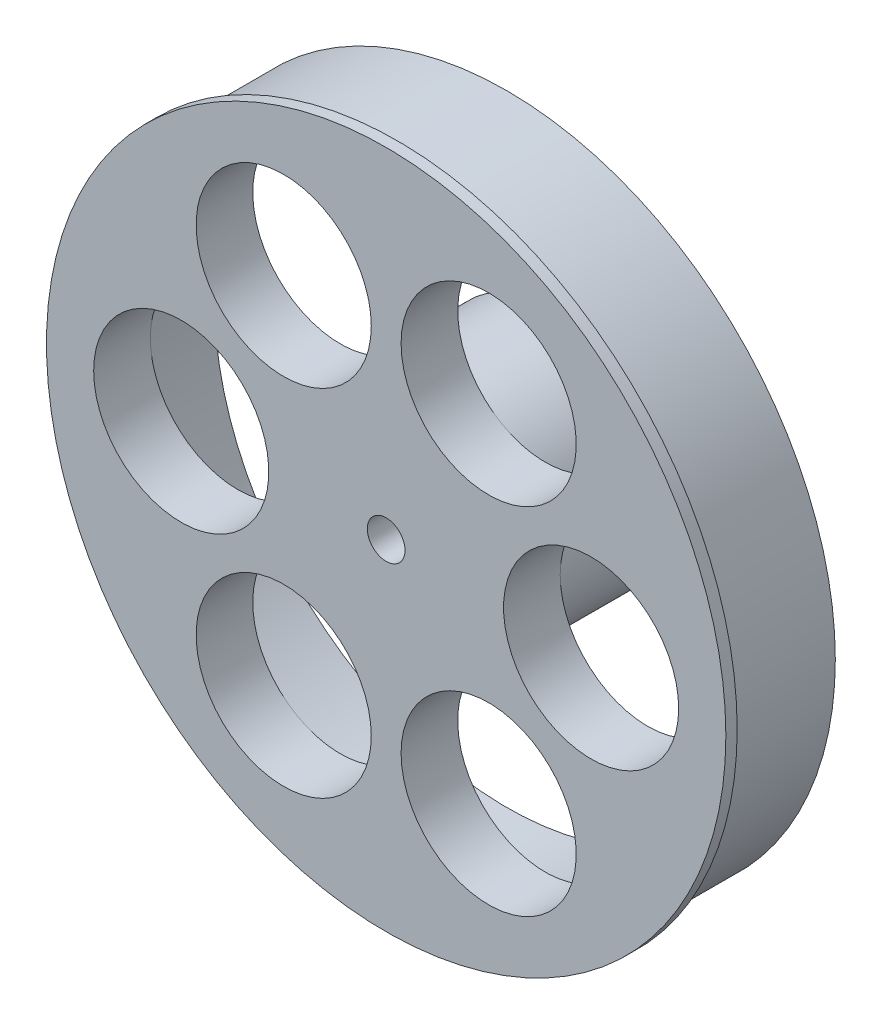
ISO-10303-21;
HEADER;
FILE_DESCRIPTION(('STEP AP214'),'2;1');
FILE_NAME('part.step','',(''),(''),'','','');
FILE_SCHEMA(('AUTOMOTIVE_DESIGN { 1 0 10303 214 1 1 1 1 }'));
ENDSEC;
DATA;
#1=APPLICATION_CONTEXT('core data for automotive mechanical design processes');
#2=APPLICATION_PROTOCOL_DEFINITION('international standard','automotive_design',2000,#1);
#3=PRODUCT_CONTEXT('',#1,'mechanical');
#4=PRODUCT('Part','Part','',(#3));
#5=PRODUCT_RELATED_PRODUCT_CATEGORY('part','',(#4));
#6=PRODUCT_DEFINITION_FORMATION('','',#4);
#7=PRODUCT_DEFINITION_CONTEXT('part definition',#1,'design');
#8=PRODUCT_DEFINITION('design','',#6,#7);
#9=PRODUCT_DEFINITION_SHAPE('','',#8);
#10=(LENGTH_UNIT() NAMED_UNIT(*) SI_UNIT(.MILLI.,.METRE.));
#11=(NAMED_UNIT(*) PLANE_ANGLE_UNIT() SI_UNIT($,.RADIAN.));
#12=(NAMED_UNIT(*) SI_UNIT($,.STERADIAN.) SOLID_ANGLE_UNIT());
#13=UNCERTAINTY_MEASURE_WITH_UNIT(LENGTH_MEASURE(1.E-05),#10,'distance_accuracy_value','');
#14=(GEOMETRIC_REPRESENTATION_CONTEXT(3) GLOBAL_UNCERTAINTY_ASSIGNED_CONTEXT((#13)) GLOBAL_UNIT_ASSIGNED_CONTEXT((#10,
#11,#12)) REPRESENTATION_CONTEXT('',''));
#15=CARTESIAN_POINT('',(0.,0.,0.));
#16=DIRECTION('',(0.,0.,1.));
#17=DIRECTION('',(1.,0.,0.));
#18=AXIS2_PLACEMENT_3D('',#15,#16,#17);
#19=CARTESIAN_POINT('',(0.,7.75,-1.5));
#20=DIRECTION('',(0.,0.,1.));
#21=DIRECTION('',(1.,0.,0.));
#22=AXIS2_PLACEMENT_3D('',#19,#20,#21);
#23=PLANE('',#22);
#24=CARTESIAN_POINT('',(0.,0.,-1.5));
#25=DIRECTION('',(0.,0.,1.));
#26=DIRECTION('',(1.,0.,0.));
#27=AXIS2_PLACEMENT_3D('',#24,#25,#26);
#28=CIRCLE('',#27,7.75);
#29=CARTESIAN_POINT('',(3.87500000000008,6.71169687932936,-1.5));
#30=VERTEX_POINT('',#29);
#31=CARTESIAN_POINT('',(-3.87499999999994,6.71169687932943,-1.5));
#32=VERTEX_POINT('',#31);
#33=EDGE_CURVE('E124',#30,#32,#28,.T.);
#34=ORIENTED_EDGE('',*,*,#33,.F.);
#35=CARTESIAN_POINT('',(2.71500000000005,4.70251794254947,-1.5));
#36=DIRECTION('',(0.,0.,1.));
#37=DIRECTION('',(1.,0.,0.));
#38=AXIS2_PLACEMENT_3D('',#35,#36,#37);
#39=CIRCLE('',#38,2.32);
#40=CARTESIAN_POINT('',(1.55500000000003,2.69333900576959,-1.5));
#41=VERTEX_POINT('',#40);
#42=EDGE_CURVE('E58',#41,#30,#39,.F.);
#43=ORIENTED_EDGE('',*,*,#42,.F.);
#44=CARTESIAN_POINT('',(0.,0.,-1.5));
#45=DIRECTION('',(0.,0.,1.));
#46=DIRECTION('',(1.,0.,0.));
#47=AXIS2_PLACEMENT_3D('',#44,#45,#46);
#48=CIRCLE('',#47,3.11);
#49=CARTESIAN_POINT('',(-1.55499999999997,2.69333900576962,-1.5));
#50=VERTEX_POINT('',#49);
#51=EDGE_CURVE('E276',#41,#50,#48,.T.);
#52=ORIENTED_EDGE('',*,*,#51,.T.);
#53=CARTESIAN_POINT('',(-2.71499999999996,4.70251794254953,-1.5));
#54=DIRECTION('',(0.,0.,1.));
#55=DIRECTION('',(1.,0.,0.));
#56=AXIS2_PLACEMENT_3D('',#53,#54,#55);
#57=CIRCLE('',#56,2.32);
#58=EDGE_CURVE('E237',#32,#50,#57,.F.);
#59=ORIENTED_EDGE('',*,*,#58,.F.);
#60=EDGE_LOOP('',(#34,#43,#52,#59));
#61=FACE_BOUND('',#60,.T.);
#62=ADVANCED_FACE('F37',(#61),#23,.F.);
#63=CARTESIAN_POINT('',(-7.75,0.,-1.5));
#64=VERTEX_POINT('',#63);
#65=EDGE_CURVE('E123',#32,#64,#28,.T.);
#66=ORIENTED_EDGE('',*,*,#65,.F.);
#67=EDGE_CURVE('E51',#50,#32,#57,.F.);
#68=ORIENTED_EDGE('',*,*,#67,.F.);
#69=CARTESIAN_POINT('',(-3.11,0.,-1.5));
#70=VERTEX_POINT('',#69);
#71=EDGE_CURVE('E281',#50,#70,#48,.T.);
#72=ORIENTED_EDGE('',*,*,#71,.T.);
#73=CARTESIAN_POINT('',(-5.43,0.,-1.5));
#74=DIRECTION('',(0.,0.,1.));
#75=DIRECTION('',(1.,0.,0.));
#76=AXIS2_PLACEMENT_3D('',#73,#74,#75);
#77=CIRCLE('',#76,2.32);
#78=EDGE_CURVE('E228',#64,#70,#77,.F.);
#79=ORIENTED_EDGE('',*,*,#78,.F.);
#80=EDGE_LOOP('',(#66,#68,#72,#79));
#81=FACE_BOUND('',#80,.T.);
#82=ADVANCED_FACE('F171',(#81),#23,.F.);
#83=CARTESIAN_POINT('',(3.11,0.,-1.5));
#84=VERTEX_POINT('',#83);
#85=EDGE_CURVE('E129',#84,#41,#48,.T.);
#86=ORIENTED_EDGE('',*,*,#85,.T.);
#87=EDGE_CURVE('E242',#30,#41,#39,.F.);
#88=ORIENTED_EDGE('',*,*,#87,.F.);
#89=CARTESIAN_POINT('',(7.75,0.,-1.5));
#90=VERTEX_POINT('',#89);
#91=EDGE_CURVE('E125',#90,#30,#28,.T.);
#92=ORIENTED_EDGE('',*,*,#91,.F.);
#93=CARTESIAN_POINT('',(5.43,0.,-1.5));
#94=DIRECTION('',(0.,0.,1.));
#95=DIRECTION('',(1.,0.,0.));
#96=AXIS2_PLACEMENT_3D('',#93,#94,#95);
#97=CIRCLE('',#96,2.32);
#98=EDGE_CURVE('E251',#84,#90,#97,.F.);
#99=ORIENTED_EDGE('',*,*,#98,.F.);
#100=EDGE_LOOP('',(#86,#88,#92,#99));
#101=FACE_BOUND('',#100,.T.);
#102=ADVANCED_FACE('F176',(#101),#23,.F.);
#103=CARTESIAN_POINT('',(-3.87500000000003,-6.71169687932938,-1.5));
#104=VERTEX_POINT('',#103);
#105=EDGE_CURVE('E105',#64,#104,#28,.T.);
#106=ORIENTED_EDGE('',*,*,#105,.F.);
#107=EDGE_CURVE('E226',#70,#64,#77,.F.);
#108=ORIENTED_EDGE('',*,*,#107,.F.);
#109=CARTESIAN_POINT('',(-1.55500000000001,-2.6933390057696,-1.5));
#110=VERTEX_POINT('',#109);
#111=EDGE_CURVE('E108',#70,#110,#48,.T.);
#112=ORIENTED_EDGE('',*,*,#111,.T.);
#113=CARTESIAN_POINT('',(-2.71500000000002,-4.70251794254949,-1.5));
#114=DIRECTION('',(0.,0.,1.));
#115=DIRECTION('',(1.,0.,0.));
#116=AXIS2_PLACEMENT_3D('',#113,#114,#115);
#117=CIRCLE('',#116,2.32);
#118=EDGE_CURVE('E92',#104,#110,#117,.F.);
#119=ORIENTED_EDGE('',*,*,#118,.F.);
#120=EDGE_LOOP('',(#106,#108,#112,#119));
#121=FACE_BOUND('',#120,.T.);
#122=ADVANCED_FACE('F102',(#121),#23,.F.);
#123=CARTESIAN_POINT('',(3.87499999999998,-6.71169687932941,-1.5));
#124=VERTEX_POINT('',#123);
#125=EDGE_CURVE('E112',#104,#124,#28,.T.);
#126=ORIENTED_EDGE('',*,*,#125,.F.);
#127=EDGE_CURVE('E89',#110,#104,#117,.F.);
#128=ORIENTED_EDGE('',*,*,#127,.F.);
#129=CARTESIAN_POINT('',(1.55499999999999,-2.69333900576961,-1.5));
#130=VERTEX_POINT('',#129);
#131=EDGE_CURVE('E271',#110,#130,#48,.T.);
#132=ORIENTED_EDGE('',*,*,#131,.T.);
#133=CARTESIAN_POINT('',(2.71499999999999,-4.70251794254951,-1.5));
#134=DIRECTION('',(0.,0.,1.));
#135=DIRECTION('',(1.,0.,0.));
#136=AXIS2_PLACEMENT_3D('',#133,#134,#135);
#137=CIRCLE('',#136,2.32);
#138=EDGE_CURVE('E114',#124,#130,#137,.F.);
#139=ORIENTED_EDGE('',*,*,#138,.F.);
#140=EDGE_LOOP('',(#126,#128,#132,#139));
#141=FACE_BOUND('',#140,.T.);
#142=ADVANCED_FACE('F113',(#141),#23,.F.);
#143=CARTESIAN_POINT('',(0.,0.5,0.));
#144=DIRECTION('',(0.,0.,-1.));
#145=DIRECTION('',(-1.,0.,0.));
#146=AXIS2_PLACEMENT_3D('',#143,#144,#145);
#147=PLANE('',#146);
#148=CARTESIAN_POINT('',(2.71500000000005,4.70251794254947,0.));
#149=DIRECTION('',(0.,0.,1.));
#150=DIRECTION('',(0.50000000000001,0.866025403784433,0.));
#151=AXIS2_PLACEMENT_3D('',#148,#149,#150);
#152=CIRCLE('',#151,2.32);
#153=CARTESIAN_POINT('',(3.87500000000008,6.71169687932935,0.));
#154=VERTEX_POINT('',#153);
#155=EDGE_CURVE('E239',#154,#154,#152,.T.);
#156=ORIENTED_EDGE('',*,*,#155,.F.);
#157=EDGE_LOOP('',(#156));
#158=FACE_BOUND('',#157,.T.);
#159=CARTESIAN_POINT('',(-2.71499999999996,4.70251794254953,0.));
#160=DIRECTION('',(0.,0.,1.));
#161=DIRECTION('',(-0.499999999999992,0.866025403784443,0.));
#162=AXIS2_PLACEMENT_3D('',#159,#160,#161);
#163=CIRCLE('',#162,2.32);
#164=CARTESIAN_POINT('',(-3.87499999999994,6.71169687932943,0.));
#165=VERTEX_POINT('',#164);
#166=EDGE_CURVE('E234',#165,#165,#163,.T.);
#167=ORIENTED_EDGE('',*,*,#166,.F.);
#168=EDGE_LOOP('',(#167));
#169=FACE_BOUND('',#168,.T.);
#170=CARTESIAN_POINT('',(-5.43,0.,0.));
#171=DIRECTION('',(0.,0.,1.));
#172=DIRECTION('',(-1.,0.,0.));
#173=AXIS2_PLACEMENT_3D('',#170,#171,#172);
#174=CIRCLE('',#173,2.32);
#175=CARTESIAN_POINT('',(-7.75,0.,0.));
#176=VERTEX_POINT('',#175);
#177=EDGE_CURVE('E231',#176,#176,#174,.T.);
#178=ORIENTED_EDGE('',*,*,#177,.F.);
#179=EDGE_LOOP('',(#178));
#180=FACE_BOUND('',#179,.T.);
#181=CARTESIAN_POINT('',(-2.71500000000002,-4.70251794254949,0.));
#182=DIRECTION('',(0.,0.,1.));
#183=DIRECTION('',(-0.500000000000004,-0.866025403784436,0.));
#184=AXIS2_PLACEMENT_3D('',#181,#182,#183);
#185=CIRCLE('',#184,2.32);
#186=CARTESIAN_POINT('',(-3.87500000000003,-6.71169687932938,0.));
#187=VERTEX_POINT('',#186);
#188=EDGE_CURVE('E97',#187,#187,#185,.T.);
#189=ORIENTED_EDGE('',*,*,#188,.F.);
#190=EDGE_LOOP('',(#189));
#191=FACE_BOUND('',#190,.T.);
#192=CARTESIAN_POINT('',(2.71499999999999,-4.70251794254951,0.));
#193=DIRECTION('',(0.,0.,1.));
#194=DIRECTION('',(0.499999999999998,-0.86602540378444,0.));
#195=AXIS2_PLACEMENT_3D('',#192,#193,#194);
#196=CIRCLE('',#195,2.32);
#197=CARTESIAN_POINT('',(3.87499999999998,-6.71169687932941,0.));
#198=VERTEX_POINT('',#197);
#199=EDGE_CURVE('E109',#198,#198,#196,.T.);
#200=ORIENTED_EDGE('',*,*,#199,.F.);
#201=EDGE_LOOP('',(#200));
#202=FACE_BOUND('',#201,.T.);
#203=CARTESIAN_POINT('',(5.43,0.,0.));
#204=DIRECTION('',(0.,0.,1.));
#205=DIRECTION('',(1.,0.,0.));
#206=AXIS2_PLACEMENT_3D('',#203,#204,#205);
#207=CIRCLE('',#206,2.32);
#208=CARTESIAN_POINT('',(7.75,0.,0.));
#209=VERTEX_POINT('',#208);
#210=EDGE_CURVE('E248',#209,#209,#207,.T.);
#211=ORIENTED_EDGE('',*,*,#210,.F.);
#212=EDGE_LOOP('',(#211));
#213=FACE_BOUND('',#212,.T.);
#214=CARTESIAN_POINT('',(0.,0.,0.));
#215=DIRECTION('',(0.,0.,1.));
#216=DIRECTION('',(1.,0.,0.));
#217=AXIS2_PLACEMENT_3D('',#214,#215,#216);
#218=CIRCLE('',#217,0.5);
#219=CARTESIAN_POINT('',(0.5,0.,0.));
#220=VERTEX_POINT('',#219);
#221=EDGE_CURVE('E255',#220,#220,#218,.T.);
#222=ORIENTED_EDGE('',*,*,#221,.F.);
#223=EDGE_LOOP('',(#222));
#224=FACE_BOUND('',#223,.T.);
#225=CARTESIAN_POINT('',(0.,0.,0.));
#226=DIRECTION('',(0.,0.,1.));
#227=DIRECTION('',(1.,0.,0.));
#228=AXIS2_PLACEMENT_3D('',#225,#226,#227);
#229=CIRCLE('',#228,9.);
#230=CARTESIAN_POINT('',(9.,0.,0.));
#231=VERTEX_POINT('',#230);
#232=EDGE_CURVE('E11',#231,#231,#229,.T.);
#233=ORIENTED_EDGE('',*,*,#232,.T.);
#234=EDGE_LOOP('',(#233));
#235=FACE_BOUND('',#234,.T.);
#236=ADVANCED_FACE('F39',(#158,#169,#180,#191,#202,#213,#224,#235),#147,.F.);
#237=CARTESIAN_POINT('',(0.,0.,59.8380004578011));
#238=DIRECTION('',(0.,0.,1.));
#239=DIRECTION('',(1.,0.,0.));
#240=AXIS2_PLACEMENT_3D('',#237,#238,#239);
#241=CYLINDRICAL_SURFACE('',#240,9.);
#242=ORIENTED_EDGE('',*,*,#232,.F.);
#243=EDGE_LOOP('',(#242));
#244=FACE_BOUND('',#243,.T.);
#245=CARTESIAN_POINT('',(0.,0.,-0.300000000000002));
#246=DIRECTION('',(0.,0.,1.));
#247=DIRECTION('',(1.,0.,0.));
#248=AXIS2_PLACEMENT_3D('',#245,#246,#247);
#249=CIRCLE('',#248,9.);
#250=CARTESIAN_POINT('',(9.,0.,-0.300000000000002));
#251=VERTEX_POINT('',#250);
#252=EDGE_CURVE('E45',#251,#251,#249,.T.);
#253=ORIENTED_EDGE('',*,*,#252,.T.);
#254=EDGE_LOOP('',(#253));
#255=FACE_BOUND('',#254,.T.);
#256=ADVANCED_FACE('F141',(#244,#255),#241,.T.);
#257=CARTESIAN_POINT('',(0.,8.7,-0.3));
#258=DIRECTION('',(0.,0.,1.));
#259=DIRECTION('',(1.,0.,0.));
#260=AXIS2_PLACEMENT_3D('',#257,#258,#259);
#261=PLANE('',#260);
#262=ORIENTED_EDGE('',*,*,#252,.F.);
#263=EDGE_LOOP('',(#262));
#264=FACE_BOUND('',#263,.T.);
#265=CARTESIAN_POINT('',(0.,0.,-0.300000000000002));
#266=DIRECTION('',(0.,0.,1.));
#267=DIRECTION('',(1.,0.,0.));
#268=AXIS2_PLACEMENT_3D('',#265,#266,#267);
#269=CIRCLE('',#268,8.7);
#270=CARTESIAN_POINT('',(8.7,0.,-0.300000000000002));
#271=VERTEX_POINT('',#270);
#272=EDGE_CURVE('E136',#271,#271,#269,.T.);
#273=ORIENTED_EDGE('',*,*,#272,.T.);
#274=EDGE_LOOP('',(#273));
#275=FACE_BOUND('',#274,.T.);
#276=ADVANCED_FACE('F143',(#264,#275),#261,.F.);
#277=CARTESIAN_POINT('',(0.,0.,59.8380004578011));
#278=DIRECTION('',(0.,0.,1.));
#279=DIRECTION('',(1.,0.,0.));
#280=AXIS2_PLACEMENT_3D('',#277,#278,#279);
#281=CYLINDRICAL_SURFACE('',#280,8.7);
#282=ORIENTED_EDGE('',*,*,#272,.F.);
#283=EDGE_LOOP('',(#282));
#284=FACE_BOUND('',#283,.T.);
#285=CARTESIAN_POINT('',(0.,0.,-3.2));
#286=DIRECTION('',(0.,0.,1.));
#287=DIRECTION('',(1.,0.,0.));
#288=AXIS2_PLACEMENT_3D('',#285,#286,#287);
#289=CIRCLE('',#288,8.7);
#290=CARTESIAN_POINT('',(8.7,0.,-3.2));
#291=VERTEX_POINT('',#290);
#292=EDGE_CURVE('E133',#291,#291,#289,.T.);
#293=ORIENTED_EDGE('',*,*,#292,.T.);
#294=EDGE_LOOP('',(#293));
#295=FACE_BOUND('',#294,.T.);
#296=ADVANCED_FACE('F146',(#284,#295),#281,.T.);
#297=CARTESIAN_POINT('',(0.,8.7,-3.2));
#298=DIRECTION('',(0.,0.,1.));
#299=DIRECTION('',(1.,0.,0.));
#300=AXIS2_PLACEMENT_3D('',#297,#298,#299);
#301=PLANE('',#300);
#302=ORIENTED_EDGE('',*,*,#292,.F.);
#303=EDGE_LOOP('',(#302));
#304=FACE_BOUND('',#303,.T.);
#305=CARTESIAN_POINT('',(0.,0.,-3.2));
#306=DIRECTION('',(0.,0.,1.));
#307=DIRECTION('',(1.,0.,0.));
#308=AXIS2_PLACEMENT_3D('',#305,#306,#307);
#309=CIRCLE('',#308,7.75);
#310=CARTESIAN_POINT('',(7.75,0.,-3.2));
#311=VERTEX_POINT('',#310);
#312=EDGE_CURVE('E128',#311,#311,#309,.T.);
#313=ORIENTED_EDGE('',*,*,#312,.T.);
#314=EDGE_LOOP('',(#313));
#315=FACE_BOUND('',#314,.T.);
#316=ADVANCED_FACE('F152',(#304,#315),#301,.F.);
#317=CARTESIAN_POINT('',(0.,0.,59.8380004578011));
#318=DIRECTION('',(0.,0.,1.));
#319=DIRECTION('',(1.,0.,0.));
#320=AXIS2_PLACEMENT_3D('',#317,#318,#319);
#321=CYLINDRICAL_SURFACE('',#320,7.75);
#322=ORIENTED_EDGE('',*,*,#312,.F.);
#323=EDGE_LOOP('',(#322));
#324=FACE_BOUND('',#323,.T.);
#325=ORIENTED_EDGE('',*,*,#91,.T.);
#326=ORIENTED_EDGE('',*,*,#33,.T.);
#327=ORIENTED_EDGE('',*,*,#65,.T.);
#328=ORIENTED_EDGE('',*,*,#105,.T.);
#329=ORIENTED_EDGE('',*,*,#125,.T.);
#330=EDGE_CURVE('E117',#124,#90,#28,.T.);
#331=ORIENTED_EDGE('',*,*,#330,.T.);
#332=EDGE_LOOP('',(#325,#326,#327,#328,#329,#331));
#333=FACE_BOUND('',#332,.T.);
#334=ADVANCED_FACE('F120',(#324,#333),#321,.F.);
#335=ORIENTED_EDGE('',*,*,#330,.F.);
#336=EDGE_CURVE('E246',#130,#124,#137,.F.);
#337=ORIENTED_EDGE('',*,*,#336,.F.);
#338=EDGE_CURVE('E268',#130,#84,#48,.T.);
#339=ORIENTED_EDGE('',*,*,#338,.T.);
#340=EDGE_CURVE('E252',#90,#84,#97,.F.);
#341=ORIENTED_EDGE('',*,*,#340,.F.);
#342=EDGE_LOOP('',(#335,#337,#339,#341));
#343=FACE_BOUND('',#342,.T.);
#344=ADVANCED_FACE('F162',(#343),#23,.F.);
#345=CARTESIAN_POINT('',(0.,0.,59.8380004578011));
#346=DIRECTION('',(0.,0.,1.));
#347=DIRECTION('',(1.,0.,0.));
#348=AXIS2_PLACEMENT_3D('',#345,#346,#347);
#349=CYLINDRICAL_SURFACE('',#348,3.11);
#350=ORIENTED_EDGE('',*,*,#85,.F.);
#351=ORIENTED_EDGE('',*,*,#338,.F.);
#352=ORIENTED_EDGE('',*,*,#131,.F.);
#353=ORIENTED_EDGE('',*,*,#111,.F.);
#354=ORIENTED_EDGE('',*,*,#71,.F.);
#355=ORIENTED_EDGE('',*,*,#51,.F.);
#356=EDGE_LOOP('',(#350,#351,#352,#353,#354,#355));
#357=FACE_BOUND('',#356,.T.);
#358=CARTESIAN_POINT('',(0.,0.,-4.39999999999999));
#359=DIRECTION('',(0.,0.,1.));
#360=DIRECTION('',(1.,0.,0.));
#361=AXIS2_PLACEMENT_3D('',#358,#359,#360);
#362=CIRCLE('',#361,3.11);
#363=CARTESIAN_POINT('',(3.11,0.,-4.39999999999999));
#364=VERTEX_POINT('',#363);
#365=EDGE_CURVE('E266',#364,#364,#362,.T.);
#366=ORIENTED_EDGE('',*,*,#365,.T.);
#367=EDGE_LOOP('',(#366));
#368=FACE_BOUND('',#367,.T.);
#369=ADVANCED_FACE('F167',(#357,#368),#349,.T.);
#370=CARTESIAN_POINT('',(0.,3.11,-4.4));
#371=DIRECTION('',(0.,0.,1.));
#372=DIRECTION('',(1.,0.,0.));
#373=AXIS2_PLACEMENT_3D('',#370,#371,#372);
#374=PLANE('',#373);
#375=ORIENTED_EDGE('',*,*,#365,.F.);
#376=EDGE_LOOP('',(#375));
#377=FACE_BOUND('',#376,.T.);
#378=CARTESIAN_POINT('',(0.,0.,-4.39999999999999));
#379=DIRECTION('',(0.,0.,1.));
#380=DIRECTION('',(1.,0.,0.));
#381=AXIS2_PLACEMENT_3D('',#378,#379,#380);
#382=CIRCLE('',#381,2.11);
#383=CARTESIAN_POINT('',(2.11,0.,-4.39999999999999));
#384=VERTEX_POINT('',#383);
#385=EDGE_CURVE('E264',#384,#384,#382,.T.);
#386=ORIENTED_EDGE('',*,*,#385,.T.);
#387=EDGE_LOOP('',(#386));
#388=FACE_BOUND('',#387,.T.);
#389=ADVANCED_FACE('F182',(#377,#388),#374,.F.);
#390=CARTESIAN_POINT('',(0.,0.,59.8380004578011));
#391=DIRECTION('',(0.,0.,1.));
#392=DIRECTION('',(1.,0.,0.));
#393=AXIS2_PLACEMENT_3D('',#390,#391,#392);
#394=CYLINDRICAL_SURFACE('',#393,2.11);
#395=ORIENTED_EDGE('',*,*,#385,.F.);
#396=EDGE_LOOP('',(#395));
#397=FACE_BOUND('',#396,.T.);
#398=CARTESIAN_POINT('',(0.,0.,-2.3));
#399=DIRECTION('',(0.,0.,1.));
#400=DIRECTION('',(1.,0.,0.));
#401=AXIS2_PLACEMENT_3D('',#398,#399,#400);
#402=CIRCLE('',#401,2.11);
#403=CARTESIAN_POINT('',(2.11,0.,-2.3));
#404=VERTEX_POINT('',#403);
#405=EDGE_CURVE('E261',#404,#404,#402,.T.);
#406=ORIENTED_EDGE('',*,*,#405,.T.);
#407=EDGE_LOOP('',(#406));
#408=FACE_BOUND('',#407,.T.);
#409=ADVANCED_FACE('F186',(#397,#408),#394,.F.);
#410=CARTESIAN_POINT('',(0.,2.11,-2.3));
#411=DIRECTION('',(0.,0.,1.));
#412=DIRECTION('',(1.,0.,0.));
#413=AXIS2_PLACEMENT_3D('',#410,#411,#412);
#414=PLANE('',#413);
#415=ORIENTED_EDGE('',*,*,#405,.F.);
#416=EDGE_LOOP('',(#415));
#417=FACE_BOUND('',#416,.T.);
#418=CARTESIAN_POINT('',(0.,0.,-2.3));
#419=DIRECTION('',(0.,0.,1.));
#420=DIRECTION('',(1.,0.,0.));
#421=AXIS2_PLACEMENT_3D('',#418,#419,#420);
#422=CIRCLE('',#421,0.5);
#423=CARTESIAN_POINT('',(0.5,0.,-2.3));
#424=VERTEX_POINT('',#423);
#425=EDGE_CURVE('E258',#424,#424,#422,.T.);
#426=ORIENTED_EDGE('',*,*,#425,.T.);
#427=EDGE_LOOP('',(#426));
#428=FACE_BOUND('',#427,.T.);
#429=ADVANCED_FACE('F190',(#417,#428),#414,.F.);
#430=CARTESIAN_POINT('',(0.,0.,59.8380004578011));
#431=DIRECTION('',(0.,0.,1.));
#432=DIRECTION('',(1.,0.,0.));
#433=AXIS2_PLACEMENT_3D('',#430,#431,#432);
#434=CYLINDRICAL_SURFACE('',#433,0.5);
#435=ORIENTED_EDGE('',*,*,#425,.F.);
#436=EDGE_LOOP('',(#435));
#437=FACE_BOUND('',#436,.T.);
#438=ORIENTED_EDGE('',*,*,#221,.T.);
#439=EDGE_LOOP('',(#438));
#440=FACE_BOUND('',#439,.T.);
#441=ADVANCED_FACE('F194',(#437,#440),#434,.F.);
#442=CARTESIAN_POINT('',(5.43,0.,-4.40099999999999));
#443=DIRECTION('',(0.,0.,1.));
#444=DIRECTION('',(1.,0.,0.));
#445=AXIS2_PLACEMENT_3D('',#442,#443,#444);
#446=CYLINDRICAL_SURFACE('',#445,2.32);
#447=ORIENTED_EDGE('',*,*,#210,.T.);
#448=EDGE_LOOP('',(#447));
#449=FACE_BOUND('',#448,.T.);
#450=ORIENTED_EDGE('',*,*,#340,.T.);
#451=ORIENTED_EDGE('',*,*,#98,.T.);
#452=EDGE_LOOP('',(#450,#451));
#453=FACE_BOUND('',#452,.T.);
#454=ADVANCED_FACE('F198',(#449,#453),#446,.F.);
#455=CARTESIAN_POINT('',(2.71499999999999,-4.70251794254951,-4.40099999999999));
#456=DIRECTION('',(0.,0.,1.));
#457=DIRECTION('',(1.,0.,0.));
#458=AXIS2_PLACEMENT_3D('',#455,#456,#457);
#459=CYLINDRICAL_SURFACE('',#458,2.32);
#460=ORIENTED_EDGE('',*,*,#199,.T.);
#461=EDGE_LOOP('',(#460));
#462=FACE_BOUND('',#461,.T.);
#463=ORIENTED_EDGE('',*,*,#138,.T.);
#464=ORIENTED_EDGE('',*,*,#336,.T.);
#465=EDGE_LOOP('',(#463,#464));
#466=FACE_BOUND('',#465,.T.);
#467=ADVANCED_FACE('F202',(#462,#466),#459,.F.);
#468=CARTESIAN_POINT('',(-2.71500000000002,-4.70251794254949,-4.40099999999999));
#469=DIRECTION('',(0.,0.,1.));
#470=DIRECTION('',(1.,0.,0.));
#471=AXIS2_PLACEMENT_3D('',#468,#469,#470);
#472=CYLINDRICAL_SURFACE('',#471,2.32);
#473=ORIENTED_EDGE('',*,*,#188,.T.);
#474=EDGE_LOOP('',(#473));
#475=FACE_BOUND('',#474,.T.);
#476=ORIENTED_EDGE('',*,*,#118,.T.);
#477=ORIENTED_EDGE('',*,*,#127,.T.);
#478=EDGE_LOOP('',(#476,#477));
#479=FACE_BOUND('',#478,.T.);
#480=ADVANCED_FACE('F91',(#475,#479),#472,.F.);
#481=CARTESIAN_POINT('',(-5.43,0.,-4.40099999999999));
#482=DIRECTION('',(0.,0.,1.));
#483=DIRECTION('',(1.,0.,0.));
#484=AXIS2_PLACEMENT_3D('',#481,#482,#483);
#485=CYLINDRICAL_SURFACE('',#484,2.32);
#486=ORIENTED_EDGE('',*,*,#177,.T.);
#487=EDGE_LOOP('',(#486));
#488=FACE_BOUND('',#487,.T.);
#489=ORIENTED_EDGE('',*,*,#107,.T.);
#490=ORIENTED_EDGE('',*,*,#78,.T.);
#491=EDGE_LOOP('',(#489,#490));
#492=FACE_BOUND('',#491,.T.);
#493=ADVANCED_FACE('F214',(#488,#492),#485,.F.);
#494=CARTESIAN_POINT('',(-2.71499999999996,4.70251794254953,-4.40099999999999));
#495=DIRECTION('',(0.,0.,1.));
#496=DIRECTION('',(1.,0.,0.));
#497=AXIS2_PLACEMENT_3D('',#494,#495,#496);
#498=CYLINDRICAL_SURFACE('',#497,2.32);
#499=ORIENTED_EDGE('',*,*,#166,.T.);
#500=EDGE_LOOP('',(#499));
#501=FACE_BOUND('',#500,.T.);
#502=ORIENTED_EDGE('',*,*,#67,.T.);
#503=ORIENTED_EDGE('',*,*,#58,.T.);
#504=EDGE_LOOP('',(#502,#503));
#505=FACE_BOUND('',#504,.T.);
#506=ADVANCED_FACE('F210',(#501,#505),#498,.F.);
#507=CARTESIAN_POINT('',(2.71500000000005,4.70251794254947,-4.40099999999999));
#508=DIRECTION('',(0.,0.,1.));
#509=DIRECTION('',(1.,0.,0.));
#510=AXIS2_PLACEMENT_3D('',#507,#508,#509);
#511=CYLINDRICAL_SURFACE('',#510,2.32);
#512=ORIENTED_EDGE('',*,*,#155,.T.);
#513=EDGE_LOOP('',(#512));
#514=FACE_BOUND('',#513,.T.);
#515=ORIENTED_EDGE('',*,*,#42,.T.);
#516=ORIENTED_EDGE('',*,*,#87,.T.);
#517=EDGE_LOOP('',(#515,#516));
#518=FACE_BOUND('',#517,.T.);
#519=ADVANCED_FACE('F207',(#514,#518),#511,.F.);
#520=CLOSED_SHELL('',(#62,#82,#102,#122,#142,#236,#256,#276,#296,#316,#334,#344,#369,#389,#409,
#429,#441,#454,#467,#480,#493,#506,#519));
#521=MANIFOLD_SOLID_BREP('B2',#520);
#522=ADVANCED_BREP_SHAPE_REPRESENTATION('',(#18,#521),#14);
#523=SHAPE_DEFINITION_REPRESENTATION(#9,#522);
ENDSEC;
END-ISO-10303-21;
